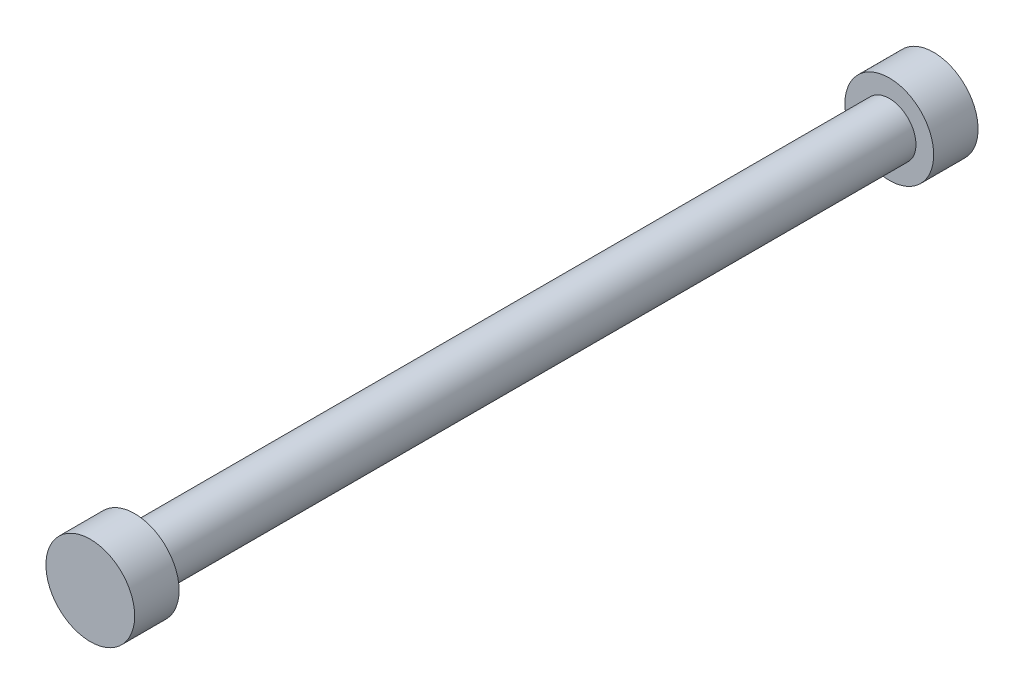
ISO-10303-21;
HEADER;
FILE_DESCRIPTION(('STEP AP214'),'2;1');
FILE_NAME('part.step','',(''),(''),'','','');
FILE_SCHEMA(('AUTOMOTIVE_DESIGN { 1 0 10303 214 1 1 1 1 }'));
ENDSEC;
DATA;
#1=APPLICATION_CONTEXT('core data for automotive mechanical design processes');
#2=APPLICATION_PROTOCOL_DEFINITION('international standard','automotive_design',2000,#1);
#3=PRODUCT_CONTEXT('',#1,'mechanical');
#4=PRODUCT('Part','Part','',(#3));
#5=PRODUCT_RELATED_PRODUCT_CATEGORY('part','',(#4));
#6=PRODUCT_DEFINITION_FORMATION('','',#4);
#7=PRODUCT_DEFINITION_CONTEXT('part definition',#1,'design');
#8=PRODUCT_DEFINITION('design','',#6,#7);
#9=PRODUCT_DEFINITION_SHAPE('','',#8);
#10=(LENGTH_UNIT() NAMED_UNIT(*) SI_UNIT(.MILLI.,.METRE.));
#11=(NAMED_UNIT(*) PLANE_ANGLE_UNIT() SI_UNIT($,.RADIAN.));
#12=(NAMED_UNIT(*) SI_UNIT($,.STERADIAN.) SOLID_ANGLE_UNIT());
#13=UNCERTAINTY_MEASURE_WITH_UNIT(LENGTH_MEASURE(1.E-05),#10,'distance_accuracy_value','');
#14=(GEOMETRIC_REPRESENTATION_CONTEXT(3) GLOBAL_UNCERTAINTY_ASSIGNED_CONTEXT((#13)) GLOBAL_UNIT_ASSIGNED_CONTEXT((#10,
#11,#12)) REPRESENTATION_CONTEXT('',''));
#15=CARTESIAN_POINT('',(0.,0.,0.));
#16=DIRECTION('',(0.,0.,1.));
#17=DIRECTION('',(1.,0.,0.));
#18=AXIS2_PLACEMENT_3D('',#15,#16,#17);
#19=CARTESIAN_POINT('',(-6.07113989896201,4.83018363030625,85.));
#20=DIRECTION('',(0.,0.,-1.));
#21=DIRECTION('',(-1.,0.,0.));
#22=AXIS2_PLACEMENT_3D('',#19,#20,#21);
#23=CYLINDRICAL_SURFACE('',#22,3.);
#24=CARTESIAN_POINT('',(-6.07113989896201,4.83018363030625,85.));
#25=DIRECTION('',(0.,0.,1.));
#26=DIRECTION('',(1.,0.,0.));
#27=AXIS2_PLACEMENT_3D('',#24,#25,#26);
#28=CIRCLE('',#27,3.);
#29=CARTESIAN_POINT('',(-3.07113989896201,4.83018363030625,85.));
#30=VERTEX_POINT('',#29);
#31=EDGE_CURVE('E10',#30,#30,#28,.T.);
#32=ORIENTED_EDGE('',*,*,#31,.F.);
#33=EDGE_LOOP('',(#32));
#34=FACE_BOUND('',#33,.T.);
#35=CARTESIAN_POINT('',(-6.07113989896201,4.83018363030625,0.));
#36=DIRECTION('',(0.,0.,1.));
#37=DIRECTION('',(1.,0.,0.));
#38=AXIS2_PLACEMENT_3D('',#35,#36,#37);
#39=CIRCLE('',#38,3.);
#40=CARTESIAN_POINT('',(-3.07113989896201,4.83018363030625,0.));
#41=VERTEX_POINT('',#40);
#42=EDGE_CURVE('E46',#41,#41,#39,.T.);
#43=ORIENTED_EDGE('',*,*,#42,.T.);
#44=EDGE_LOOP('',(#43));
#45=FACE_BOUND('',#44,.T.);
#46=ADVANCED_FACE('F43',(#34,#45),#23,.T.);
#47=CARTESIAN_POINT('',(-6.07113989896201,4.83018363030625,-5.));
#48=DIRECTION('',(0.,0.,1.));
#49=DIRECTION('',(1.,0.,0.));
#50=AXIS2_PLACEMENT_3D('',#47,#48,#49);
#51=CYLINDRICAL_SURFACE('',#50,5.);
#52=CARTESIAN_POINT('',(-6.07113989896201,4.83018363030625,-5.));
#53=DIRECTION('',(0.,0.,-1.));
#54=DIRECTION('',(-1.,0.,0.));
#55=AXIS2_PLACEMENT_3D('',#52,#53,#54);
#56=CIRCLE('',#55,5.);
#57=CARTESIAN_POINT('',(-11.071139898962,4.83018363030625,-5.));
#58=VERTEX_POINT('',#57);
#59=EDGE_CURVE('E55',#58,#58,#56,.T.);
#60=ORIENTED_EDGE('',*,*,#59,.F.);
#61=EDGE_LOOP('',(#60));
#62=FACE_BOUND('',#61,.T.);
#63=CARTESIAN_POINT('',(-6.07113989896201,4.83018363030625,0.));
#64=DIRECTION('',(0.,0.,-1.));
#65=DIRECTION('',(-1.,0.,0.));
#66=AXIS2_PLACEMENT_3D('',#63,#64,#65);
#67=CIRCLE('',#66,5.);
#68=CARTESIAN_POINT('',(-11.071139898962,4.83018363030625,0.));
#69=VERTEX_POINT('',#68);
#70=EDGE_CURVE('E57',#69,#69,#67,.T.);
#71=ORIENTED_EDGE('',*,*,#70,.T.);
#72=EDGE_LOOP('',(#71));
#73=FACE_BOUND('',#72,.T.);
#74=ADVANCED_FACE('F90',(#62,#73),#51,.T.);
#75=CARTESIAN_POINT('',(-6.07113989896201,4.83018363030625,-5.));
#76=DIRECTION('',(0.,0.,-1.));
#77=DIRECTION('',(-1.,0.,0.));
#78=AXIS2_PLACEMENT_3D('',#75,#76,#77);
#79=PLANE('',#78);
#80=ORIENTED_EDGE('',*,*,#59,.T.);
#81=EDGE_LOOP('',(#80));
#82=FACE_BOUND('',#81,.T.);
#83=ADVANCED_FACE('F95',(#82),#79,.T.);
#84=CARTESIAN_POINT('',(-6.07113989896201,4.83018363030625,0.));
#85=DIRECTION('',(0.,0.,-1.));
#86=DIRECTION('',(-1.,0.,0.));
#87=AXIS2_PLACEMENT_3D('',#84,#85,#86);
#88=PLANE('',#87);
#89=ORIENTED_EDGE('',*,*,#42,.F.);
#90=EDGE_LOOP('',(#89));
#91=FACE_BOUND('',#90,.T.);
#92=ORIENTED_EDGE('',*,*,#70,.F.);
#93=EDGE_LOOP('',(#92));
#94=FACE_BOUND('',#93,.T.);
#95=ADVANCED_FACE('F78',(#91,#94),#88,.F.);
#96=CARTESIAN_POINT('',(-6.07113989896201,4.83018363030625,90.));
#97=DIRECTION('',(0.,0.,-1.));
#98=DIRECTION('',(-1.,0.,0.));
#99=AXIS2_PLACEMENT_3D('',#96,#97,#98);
#100=CYLINDRICAL_SURFACE('',#99,5.);
#101=CARTESIAN_POINT('',(-6.07113989896201,4.83018363030625,90.));
#102=DIRECTION('',(0.,0.,1.));
#103=DIRECTION('',(1.,0.,0.));
#104=AXIS2_PLACEMENT_3D('',#101,#102,#103);
#105=CIRCLE('',#104,5.);
#106=CARTESIAN_POINT('',(-1.07113989896201,4.83018363030625,90.));
#107=VERTEX_POINT('',#106);
#108=EDGE_CURVE('E61',#107,#107,#105,.T.);
#109=ORIENTED_EDGE('',*,*,#108,.F.);
#110=EDGE_LOOP('',(#109));
#111=FACE_BOUND('',#110,.T.);
#112=CARTESIAN_POINT('',(-6.07113989896201,4.83018363030625,85.));
#113=DIRECTION('',(0.,0.,1.));
#114=DIRECTION('',(1.,0.,0.));
#115=AXIS2_PLACEMENT_3D('',#112,#113,#114);
#116=CIRCLE('',#115,5.);
#117=CARTESIAN_POINT('',(-1.07113989896201,4.83018363030625,85.));
#118=VERTEX_POINT('',#117);
#119=EDGE_CURVE('E65',#118,#118,#116,.T.);
#120=ORIENTED_EDGE('',*,*,#119,.T.);
#121=EDGE_LOOP('',(#120));
#122=FACE_BOUND('',#121,.T.);
#123=ADVANCED_FACE('F75',(#111,#122),#100,.T.);
#124=CARTESIAN_POINT('',(-6.07113989896201,4.83018363030625,90.));
#125=DIRECTION('',(0.,0.,1.));
#126=DIRECTION('',(1.,0.,0.));
#127=AXIS2_PLACEMENT_3D('',#124,#125,#126);
#128=PLANE('',#127);
#129=ORIENTED_EDGE('',*,*,#108,.T.);
#130=EDGE_LOOP('',(#129));
#131=FACE_BOUND('',#130,.T.);
#132=ADVANCED_FACE('F73',(#131),#128,.T.);
#133=CARTESIAN_POINT('',(-6.07113989896201,4.83018363030625,85.));
#134=DIRECTION('',(0.,0.,1.));
#135=DIRECTION('',(1.,0.,0.));
#136=AXIS2_PLACEMENT_3D('',#133,#134,#135);
#137=PLANE('',#136);
#138=ORIENTED_EDGE('',*,*,#31,.T.);
#139=EDGE_LOOP('',(#138));
#140=FACE_BOUND('',#139,.T.);
#141=ORIENTED_EDGE('',*,*,#119,.F.);
#142=EDGE_LOOP('',(#141));
#143=FACE_BOUND('',#142,.T.);
#144=ADVANCED_FACE('F82',(#140,#143),#137,.F.);
#145=CLOSED_SHELL('',(#46,#74,#83,#95,#123,#132,#144));
#146=MANIFOLD_SOLID_BREP('B2',#145);
#147=ADVANCED_BREP_SHAPE_REPRESENTATION('',(#18,#146),#14);
#148=SHAPE_DEFINITION_REPRESENTATION(#9,#147);
ENDSEC;
END-ISO-10303-21;
